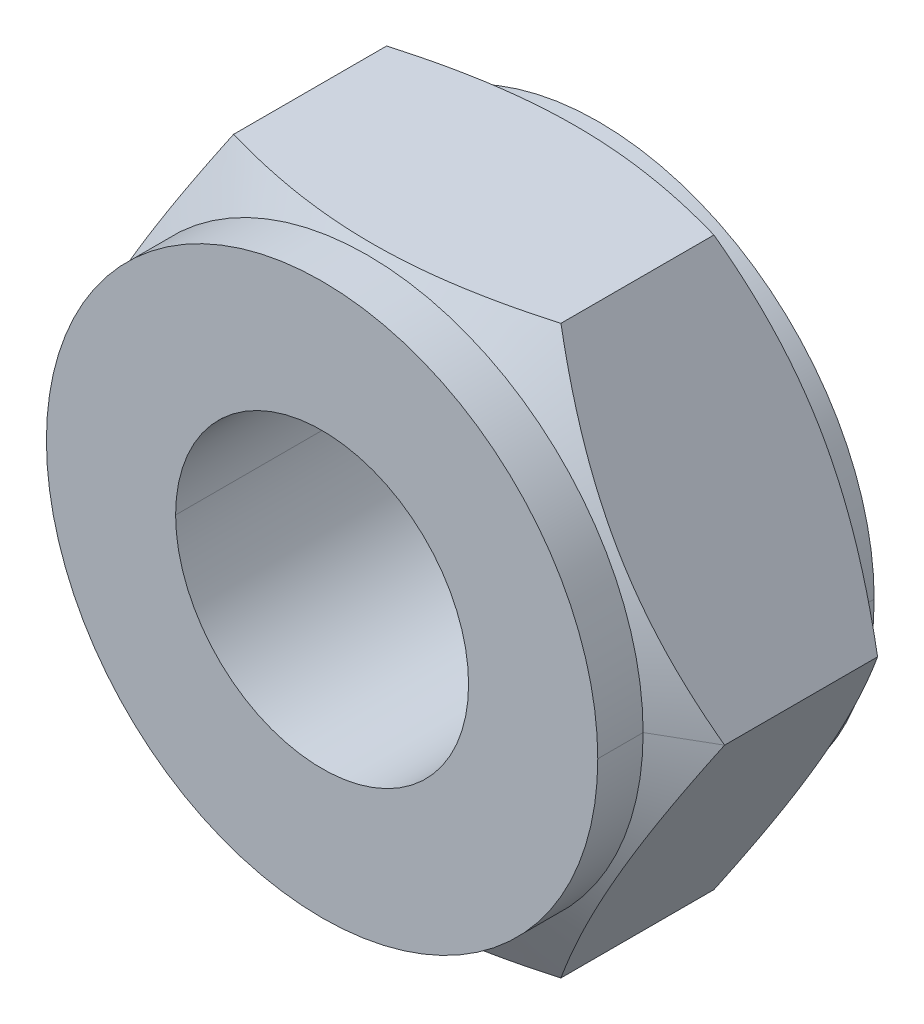
ISO-10303-21;
HEADER;
FILE_DESCRIPTION(('STEP AP214'),'2;1');
FILE_NAME('part.step','',(''),(''),'','','');
FILE_SCHEMA(('AUTOMOTIVE_DESIGN { 1 0 10303 214 1 1 1 1 }'));
ENDSEC;
DATA;
#1=APPLICATION_CONTEXT('core data for automotive mechanical design processes');
#2=APPLICATION_PROTOCOL_DEFINITION('international standard','automotive_design',2000,#1);
#3=PRODUCT_CONTEXT('',#1,'mechanical');
#4=PRODUCT('Part','Part','',(#3));
#5=PRODUCT_RELATED_PRODUCT_CATEGORY('part','',(#4));
#6=PRODUCT_DEFINITION_FORMATION('','',#4);
#7=PRODUCT_DEFINITION_CONTEXT('part definition',#1,'design');
#8=PRODUCT_DEFINITION('design','',#6,#7);
#9=PRODUCT_DEFINITION_SHAPE('','',#8);
#10=(LENGTH_UNIT() NAMED_UNIT(*) SI_UNIT(.MILLI.,.METRE.));
#11=(NAMED_UNIT(*) PLANE_ANGLE_UNIT() SI_UNIT($,.RADIAN.));
#12=(NAMED_UNIT(*) SI_UNIT($,.STERADIAN.) SOLID_ANGLE_UNIT());
#13=UNCERTAINTY_MEASURE_WITH_UNIT(LENGTH_MEASURE(1.E-05),#10,'distance_accuracy_value','');
#14=(GEOMETRIC_REPRESENTATION_CONTEXT(3) GLOBAL_UNCERTAINTY_ASSIGNED_CONTEXT((#13)) GLOBAL_UNIT_ASSIGNED_CONTEXT((#10,
#11,#12)) REPRESENTATION_CONTEXT('',''));
#15=CARTESIAN_POINT('',(0.,0.,0.));
#16=DIRECTION('',(0.,0.,1.));
#17=DIRECTION('',(1.,0.,0.));
#18=AXIS2_PLACEMENT_3D('',#15,#16,#17);
#19=CARTESIAN_POINT('',(0.,0.,0.38));
#20=DIRECTION('',(0.,0.,1.));
#21=DIRECTION('',(-1.,0.,0.));
#22=AXIS2_PLACEMENT_3D('',#19,#20,#21);
#23=PLANE('',#22);
#24=CARTESIAN_POINT('',(0.,0.,0.38));
#25=DIRECTION('',(0.,0.,1.));
#26=DIRECTION('',(1.,0.,0.));
#27=AXIS2_PLACEMENT_3D('',#24,#25,#26);
#28=CIRCLE('',#27,2.067);
#29=CARTESIAN_POINT('',(2.067,0.,0.38));
#30=VERTEX_POINT('',#29);
#31=CARTESIAN_POINT('',(-2.067,0.,0.38));
#32=VERTEX_POINT('',#31);
#33=EDGE_CURVE('E199',#30,#32,#28,.T.);
#34=ORIENTED_EDGE('',*,*,#33,.F.);
#35=CARTESIAN_POINT('',(0.,0.,0.38));
#36=DIRECTION('',(0.,0.,1.));
#37=DIRECTION('',(1.,0.,0.));
#38=AXIS2_PLACEMENT_3D('',#35,#36,#37);
#39=CIRCLE('',#38,2.067);
#40=EDGE_CURVE('E195',#32,#30,#39,.T.);
#41=ORIENTED_EDGE('',*,*,#40,.F.);
#42=EDGE_LOOP('',(#34,#41));
#43=FACE_BOUND('',#42,.T.);
#44=CARTESIAN_POINT('',(0.,0.,0.38));
#45=DIRECTION('',(0.,0.,1.));
#46=DIRECTION('',(1.,0.,0.));
#47=AXIS2_PLACEMENT_3D('',#44,#45,#46);
#48=CIRCLE('',#47,3.89);
#49=CARTESIAN_POINT('',(-3.89,0.,0.38));
#50=VERTEX_POINT('',#49);
#51=CARTESIAN_POINT('',(3.89,0.,0.38));
#52=VERTEX_POINT('',#51);
#53=EDGE_CURVE('E25',#50,#52,#48,.T.);
#54=ORIENTED_EDGE('',*,*,#53,.T.);
#55=CARTESIAN_POINT('',(0.,0.,0.38));
#56=DIRECTION('',(0.,0.,1.));
#57=DIRECTION('',(1.,0.,0.));
#58=AXIS2_PLACEMENT_3D('',#55,#56,#57);
#59=CIRCLE('',#58,3.89);
#60=EDGE_CURVE('E11',#52,#50,#59,.T.);
#61=ORIENTED_EDGE('',*,*,#60,.T.);
#62=EDGE_LOOP('',(#54,#61));
#63=FACE_BOUND('',#62,.T.);
#64=ADVANCED_FACE('F17',(#43,#63),#23,.T.);
#65=CARTESIAN_POINT('',(-4.618802153517,0.,-3.52));
#66=DIRECTION('',(-0.866025403784439,-0.5,0.));
#67=DIRECTION('',(-0.5,0.866025403784439,0.));
#68=AXIS2_PLACEMENT_3D('',#65,#66,#67);
#69=PLANE('',#68);
#70=DIRECTION('',(0.,0.,1.));
#71=VECTOR('',#70,1.);
#72=CARTESIAN_POINT('',(-2.30940107675849,-4.,-3.52));
#73=LINE('',#72,#71);
#74=CARTESIAN_POINT('',(-2.30940107675849,-4.,-2.83941825934564));
#75=VERTEX_POINT('',#74);
#76=CARTESIAN_POINT('',(-2.30940107675849,-4.,-0.680581740654357));
#77=VERTEX_POINT('',#76);
#78=EDGE_CURVE('E214',#75,#77,#73,.T.);
#79=ORIENTED_EDGE('',*,*,#78,.T.);
#80=CARTESIAN_POINT('',(-2.30940107675848,-4.,-0.68058174065436));
#81=CARTESIAN_POINT('',(-2.41088526784455,-3.82422422487392,-0.621972830907661));
#82=CARTESIAN_POINT('',(-2.51324546902432,-3.64693115575758,-0.568671094854789));
#83=CARTESIAN_POINT('',(-2.71973816979664,-3.28927530662781,-0.475634515454877));
#84=CARTESIAN_POINT('',(-2.82387433717053,-3.10890617383074,-0.435932581330531));
#85=CARTESIAN_POINT('',(-3.03085616459838,-2.75040313248224,-0.374133658546513));
#86=CARTESIAN_POINT('',(-3.13366998676625,-2.57232436876715,-0.351625315848155));
#87=CARTESIAN_POINT('',(-3.33978115171077,-2.21532935907603,-0.324760076915223));
#88=CARTESIAN_POINT('',(-3.44307774584343,-2.03641440978945,-0.320380928602726));
#89=CARTESIAN_POINT('',(-3.6360763505888,-1.70213102058057,-0.329514320963898));
#90=CARTESIAN_POINT('',(-3.72580732221447,-1.54671241871238,-0.340784311086834));
#91=CARTESIAN_POINT('',(-3.90468469745536,-1.23688771647059,-0.376496342090638));
#92=CARTESIAN_POINT('',(-3.99383048284328,-1.08248268689808,-0.400950570191663));
#93=CARTESIAN_POINT('',(-4.17307636234661,-0.772019716550943,-0.462081407331009));
#94=CARTESIAN_POINT('',(-4.26315378192128,-0.616001049232918,-0.499017025090961));
#95=CARTESIAN_POINT('',(-4.44196550493154,-0.30629005999022,-0.582845262333055));
#96=CARTESIAN_POINT('',(-4.53070209738485,-0.152593773370545,-0.629718198158769));
#97=CARTESIAN_POINT('',(-4.618802153517,0.,-0.680581740654352));
#98=B_SPLINE_CURVE_WITH_KNOTS('',3,(#80,#81,#82,#83,#84,#85,#86,#87,#88,#89,#90,#91,#92,#93,#94,
#95,#96,#97),.UNSPECIFIED.,.F.,.F.,(4,2,2,2,2,2,2,2,4),(0.,0.634032023113708,1.26958763405422,
1.88941521230584,2.50848177779564,3.04741556526379,3.58684838758882,4.13824324497734,
4.68855594702993),.UNSPECIFIED.);
#99=CARTESIAN_POINT('',(-4.61880215351701,0.,-0.680581740654357));
#100=VERTEX_POINT('',#99);
#101=EDGE_CURVE('E218',#77,#100,#98,.T.);
#102=ORIENTED_EDGE('',*,*,#101,.T.);
#103=DIRECTION('',(0.,0.,1.));
#104=VECTOR('',#103,1.);
#105=CARTESIAN_POINT('',(-4.618802153517,0.,-3.52));
#106=LINE('',#105,#104);
#107=CARTESIAN_POINT('',(-4.618802153517,0.,-2.83941825934565));
#108=VERTEX_POINT('',#107);
#109=EDGE_CURVE('E219',#108,#100,#106,.T.);
#110=ORIENTED_EDGE('',*,*,#109,.F.);
#111=CARTESIAN_POINT('',(-4.618802153517,0.,-2.83941825934565));
#112=CARTESIAN_POINT('',(-4.51731796243094,-0.175775775126077,-2.89802716909234));
#113=CARTESIAN_POINT('',(-4.41495776125117,-0.353068844242418,-2.95132890514522));
#114=CARTESIAN_POINT('',(-4.20846506047885,-0.710724693372193,-3.04436548454513));
#115=CARTESIAN_POINT('',(-4.10432889310496,-0.891093826169261,-3.08406741866947));
#116=CARTESIAN_POINT('',(-3.8973470656771,-1.24959686751776,-3.14586634145349));
#117=CARTESIAN_POINT('',(-3.79453324350924,-1.42767563123285,-3.16837468415185));
#118=CARTESIAN_POINT('',(-3.58842207856472,-1.78467064092398,-3.19523992308478));
#119=CARTESIAN_POINT('',(-3.48512548443206,-1.96358559021056,-3.19961907139727));
#120=CARTESIAN_POINT('',(-3.29212687968669,-2.29786897941944,-3.1904856790361));
#121=CARTESIAN_POINT('',(-3.20239590806102,-2.45328758128763,-3.17921568891317));
#122=CARTESIAN_POINT('',(-3.02351853282013,-2.76311228352941,-3.14350365790936));
#123=CARTESIAN_POINT('',(-2.93437274743221,-2.91751731310192,-3.11904942980834));
#124=CARTESIAN_POINT('',(-2.75512686792888,-3.22798028344906,-3.05791859266899));
#125=CARTESIAN_POINT('',(-2.66504944835421,-3.38399895076709,-3.02098297490904));
#126=CARTESIAN_POINT('',(-2.48623772534395,-3.69370994000978,-2.93715473766694));
#127=CARTESIAN_POINT('',(-2.39750113289063,-3.84740622662946,-2.89028180184123));
#128=CARTESIAN_POINT('',(-2.30940107675848,-4.,-2.83941825934564));
#129=B_SPLINE_CURVE_WITH_KNOTS('',3,(#111,#112,#113,#114,#115,#116,#117,#118,#119,#120,#121,
#122,#123,#124,#125,#126,#127,#128),.UNSPECIFIED.,.F.,.F.,(4,2,2,2,2,2,2,2,4),(0.,
0.634032023113711,1.26958763405422,1.88941521230585,2.50848177779564,3.04741556526379,
3.58684838758882,4.13824324497735,4.68855594702994),.UNSPECIFIED.);
#130=EDGE_CURVE('E117',#108,#75,#129,.T.);
#131=ORIENTED_EDGE('',*,*,#130,.T.);
#132=EDGE_LOOP('',(#79,#102,#110,#131));
#133=FACE_BOUND('',#132,.T.);
#134=ADVANCED_FACE('F254',(#133),#69,.T.);
#135=CARTESIAN_POINT('',(-2.3094010767585,4.,-3.52));
#136=DIRECTION('',(-0.866025403784439,0.5,0.));
#137=DIRECTION('',(0.5,0.866025403784439,0.));
#138=AXIS2_PLACEMENT_3D('',#135,#136,#137);
#139=PLANE('',#138);
#140=ORIENTED_EDGE('',*,*,#109,.T.);
#141=CARTESIAN_POINT('',(-4.61880215351701,0.,-0.68058174065436));
#142=CARTESIAN_POINT('',(-4.51731796243095,0.175775775126075,-0.621972830907662));
#143=CARTESIAN_POINT('',(-4.41495776125117,0.353068844242416,-0.568671094854791));
#144=CARTESIAN_POINT('',(-4.20846506047885,0.710724693372191,-0.475634515454879));
#145=CARTESIAN_POINT('',(-4.10432889310497,0.89109382616926,-0.435932581330532));
#146=CARTESIAN_POINT('',(-3.89734706567711,1.24959686751776,-0.374133658546515));
#147=CARTESIAN_POINT('',(-3.79453324350925,1.42767563123285,-0.351625315848157));
#148=CARTESIAN_POINT('',(-3.58842207856472,1.78467064092398,-0.324760076915226));
#149=CARTESIAN_POINT('',(-3.48512548443207,1.96358559021056,-0.32038092860273));
#150=CARTESIAN_POINT('',(-3.2921268796867,2.29786897941944,-0.329514320963903));
#151=CARTESIAN_POINT('',(-3.20239590806103,2.45328758128763,-0.340784311086839));
#152=CARTESIAN_POINT('',(-3.02351853282014,2.76311228352941,-0.376496342090643));
#153=CARTESIAN_POINT('',(-2.93437274743222,2.91751731310192,-0.400950570191668));
#154=CARTESIAN_POINT('',(-2.75512686792889,3.22798028344906,-0.462081407331014));
#155=CARTESIAN_POINT('',(-2.66504944835422,3.38399895076708,-0.499017025090966));
#156=CARTESIAN_POINT('',(-2.48623772534396,3.69370994000978,-0.58284526233306));
#157=CARTESIAN_POINT('',(-2.39750113289065,3.84740622662945,-0.629718198158774));
#158=CARTESIAN_POINT('',(-2.3094010767585,4.,-0.680581740654358));
#159=B_SPLINE_CURVE_WITH_KNOTS('',3,(#141,#142,#143,#144,#145,#146,#147,#148,#149,#150,#151,
#152,#153,#154,#155,#156,#157,#158),.UNSPECIFIED.,.F.,.F.,(4,2,2,2,2,2,2,2,4),(0.,
0.634032023113711,1.26958763405422,1.88941521230585,2.50848177779564,3.04741556526379,
3.58684838758882,4.13824324497734,4.68855594702993),.UNSPECIFIED.);
#160=CARTESIAN_POINT('',(-2.3094010767585,4.,-0.680581740654358));
#161=VERTEX_POINT('',#160);
#162=EDGE_CURVE('E224',#100,#161,#159,.T.);
#163=ORIENTED_EDGE('',*,*,#162,.T.);
#164=DIRECTION('',(0.,0.,1.));
#165=VECTOR('',#164,1.);
#166=CARTESIAN_POINT('',(-2.3094010767585,4.,-3.52));
#167=LINE('',#166,#165);
#168=CARTESIAN_POINT('',(-2.3094010767585,4.,-2.83941825934564));
#169=VERTEX_POINT('',#168);
#170=EDGE_CURVE('E235',#169,#161,#167,.T.);
#171=ORIENTED_EDGE('',*,*,#170,.F.);
#172=CARTESIAN_POINT('',(-2.3094010767585,4.,-2.83941825934564));
#173=CARTESIAN_POINT('',(-2.41088526784456,3.82422422487391,-2.89802716909234));
#174=CARTESIAN_POINT('',(-2.51324546902433,3.64693115575757,-2.95132890514521));
#175=CARTESIAN_POINT('',(-2.71973816979665,3.2892753066278,-3.04436548454512));
#176=CARTESIAN_POINT('',(-2.82387433717054,3.10890617383073,-3.08406741866947));
#177=CARTESIAN_POINT('',(-3.0308561645984,2.75040313248223,-3.14586634145349));
#178=CARTESIAN_POINT('',(-3.13366998676626,2.57232436876714,-3.16837468415185));
#179=CARTESIAN_POINT('',(-3.33978115171079,2.21532935907601,-3.19523992308478));
#180=CARTESIAN_POINT('',(-3.44307774584344,2.03641440978943,-3.19961907139727));
#181=CARTESIAN_POINT('',(-3.63607635058881,1.70213102058055,-3.1904856790361));
#182=CARTESIAN_POINT('',(-3.72580732221448,1.54671241871236,-3.17921568891316));
#183=CARTESIAN_POINT('',(-3.90468469745537,1.23688771647058,-3.14350365790936));
#184=CARTESIAN_POINT('',(-3.99383048284329,1.08248268689807,-3.11904942980833));
#185=CARTESIAN_POINT('',(-4.17307636234662,0.772019716550935,-3.05791859266899));
#186=CARTESIAN_POINT('',(-4.26315378192129,0.616001049232911,-3.02098297490904));
#187=CARTESIAN_POINT('',(-4.44196550493155,0.306290059990215,-2.93715473766694));
#188=CARTESIAN_POINT('',(-4.53070209738486,0.152593773370542,-2.89028180184123));
#189=CARTESIAN_POINT('',(-4.61880215351701,0.,-2.83941825934564));
#190=B_SPLINE_CURVE_WITH_KNOTS('',3,(#172,#173,#174,#175,#176,#177,#178,#179,#180,#181,#182,
#183,#184,#185,#186,#187,#188,#189),.UNSPECIFIED.,.F.,.F.,(4,2,2,2,2,2,2,2,4),(0.,
0.634032023113711,1.26958763405422,1.88941521230585,2.50848177779565,3.04741556526379,
3.58684838758882,4.13824324497734,4.68855594702993),.UNSPECIFIED.);
#191=EDGE_CURVE('E202',#169,#108,#190,.T.);
#192=ORIENTED_EDGE('',*,*,#191,.T.);
#193=EDGE_LOOP('',(#140,#163,#171,#192));
#194=FACE_BOUND('',#193,.T.);
#195=ADVANCED_FACE('F343',(#194),#139,.T.);
#196=CARTESIAN_POINT('',(-2.30940107675849,-4.,-3.52));
#197=DIRECTION('',(0.,-1.,0.));
#198=DIRECTION('',(-1.,0.,0.));
#199=AXIS2_PLACEMENT_3D('',#196,#197,#198);
#200=PLANE('',#199);
#201=DIRECTION('',(0.,0.,1.));
#202=VECTOR('',#201,1.);
#203=CARTESIAN_POINT('',(2.30940107675852,-4.,-3.52));
#204=LINE('',#203,#202);
#205=CARTESIAN_POINT('',(2.30940107675852,-4.,-2.83941825934564));
#206=VERTEX_POINT('',#205);
#207=CARTESIAN_POINT('',(2.30940107675852,-4.,-0.680581740654358));
#208=VERTEX_POINT('',#207);
#209=EDGE_CURVE('E203',#206,#208,#204,.T.);
#210=ORIENTED_EDGE('',*,*,#209,.T.);
#211=CARTESIAN_POINT('',(2.30940107675852,-4.,-0.680581740654358));
#212=CARTESIAN_POINT('',(2.10643269458639,-4.,-0.621972830907662));
#213=CARTESIAN_POINT('',(1.90171229222684,-4.,-0.568671094854791));
#214=CARTESIAN_POINT('',(1.48872689068221,-4.,-0.47563451545488));
#215=CARTESIAN_POINT('',(1.28045455593443,-4.,-0.435932581330533));
#216=CARTESIAN_POINT('',(0.866490901078722,-4.,-0.374133658546515));
#217=CARTESIAN_POINT('',(0.660863256742991,-4.,-0.351625315848158));
#218=CARTESIAN_POINT('',(0.248640926853943,-4.,-0.324760076915226));
#219=CARTESIAN_POINT('',(0.0420477385886325,-4.,-0.320380928602728));
#220=CARTESIAN_POINT('',(-0.343949470902104,-4.,-0.329514320963901));
#221=CARTESIAN_POINT('',(-0.523411414153448,-4.,-0.340784311086839));
#222=CARTESIAN_POINT('',(-0.881166164635223,-4.,-0.376496342090643));
#223=CARTESIAN_POINT('',(-1.05945773541106,-4.,-0.400950570191667));
#224=CARTESIAN_POINT('',(-1.41794949441772,-4.,-0.462081407331012));
#225=CARTESIAN_POINT('',(-1.59810433356706,-4.,-0.499017025090964));
#226=CARTESIAN_POINT('',(-1.95572777958756,-4.,-0.582845262333057));
#227=CARTESIAN_POINT('',(-2.13320096449419,-4.,-0.629718198158769));
#228=CARTESIAN_POINT('',(-2.30940107675849,-4.,-0.680581740654351));
#229=B_SPLINE_CURVE_WITH_KNOTS('',3,(#211,#212,#213,#214,#215,#216,#217,#218,#219,#220,#221,
#222,#223,#224,#225,#226,#227,#228),.UNSPECIFIED.,.F.,.F.,(4,2,2,2,2,2,2,2,4),(0.,
0.634032023113711,1.26958763405422,1.88941521230585,2.50848177779565,3.04741556526379,
3.58684838758881,4.13824324497733,4.68855594702991),.UNSPECIFIED.);
#230=EDGE_CURVE('E206',#208,#77,#229,.T.);
#231=ORIENTED_EDGE('',*,*,#230,.T.);
#232=ORIENTED_EDGE('',*,*,#78,.F.);
#233=CARTESIAN_POINT('',(-2.30940107675849,-4.,-2.83941825934565));
#234=CARTESIAN_POINT('',(-2.10643269458636,-4.,-2.89802716909235));
#235=CARTESIAN_POINT('',(-1.90171229222682,-4.,-2.95132890514522));
#236=CARTESIAN_POINT('',(-1.48872689068218,-4.,-3.04436548454513));
#237=CARTESIAN_POINT('',(-1.2804545559344,-4.,-3.08406741866947));
#238=CARTESIAN_POINT('',(-0.866490901078693,-4.,-3.14586634145349));
#239=CARTESIAN_POINT('',(-0.660863256742963,-4.,-3.16837468415185));
#240=CARTESIAN_POINT('',(-0.248640926853916,-4.,-3.19523992308478));
#241=CARTESIAN_POINT('',(-0.0420477385886054,-4.,-3.19961907139727));
#242=CARTESIAN_POINT('',(0.343949470902131,-4.,-3.1904856790361));
#243=CARTESIAN_POINT('',(0.523411414153476,-4.,-3.17921568891316));
#244=CARTESIAN_POINT('',(0.881166164635252,-4.,-3.14350365790936));
#245=CARTESIAN_POINT('',(1.05945773541109,-4.,-3.11904942980833));
#246=CARTESIAN_POINT('',(1.41794949441775,-4.,-3.05791859266899));
#247=CARTESIAN_POINT('',(1.59810433356709,-4.,-3.02098297490903));
#248=CARTESIAN_POINT('',(1.95572777958759,-4.,-2.93715473766694));
#249=CARTESIAN_POINT('',(2.13320096449422,-4.,-2.89028180184123));
#250=CARTESIAN_POINT('',(2.30940107675852,-4.,-2.83941825934564));
#251=B_SPLINE_CURVE_WITH_KNOTS('',3,(#233,#234,#235,#236,#237,#238,#239,#240,#241,#242,#243,
#244,#245,#246,#247,#248,#249,#250),.UNSPECIFIED.,.F.,.F.,(4,2,2,2,2,2,2,2,4),(0.,
0.63403202311371,1.26958763405422,1.88941521230584,2.50848177779564,3.04741556526379,
3.58684838758881,4.13824324497733,4.68855594702991),.UNSPECIFIED.);
#252=EDGE_CURVE('E138',#75,#206,#251,.T.);
#253=ORIENTED_EDGE('',*,*,#252,.T.);
#254=EDGE_LOOP('',(#210,#231,#232,#253));
#255=FACE_BOUND('',#254,.T.);
#256=ADVANCED_FACE('F352',(#255),#200,.T.);
#257=CARTESIAN_POINT('',(0.,0.,-3.52));
#258=DIRECTION('',(0.,0.,1.));
#259=DIRECTION('',(-1.,0.,0.));
#260=AXIS2_PLACEMENT_3D('',#257,#258,#259);
#261=CONICAL_SURFACE('',#260,3.44,1.0471975511966);
#262=DIRECTION('',(-0.866025403784437,0.,0.5));
#263=VECTOR('',#262,1.);
#264=CARTESIAN_POINT('',(-3.44,0.,-3.52));
#265=LINE('',#264,#263);
#266=CARTESIAN_POINT('',(-3.89,0.,-3.26019237886467));
#267=VERTEX_POINT('',#266);
#268=EDGE_CURVE('E108',#108,#267,#265,.F.);
#269=ORIENTED_EDGE('',*,*,#268,.T.);
#270=CARTESIAN_POINT('',(0.,0.,-3.26019237886467));
#271=DIRECTION('',(0.,0.,1.));
#272=DIRECTION('',(1.,0.,0.));
#273=AXIS2_PLACEMENT_3D('',#270,#271,#272);
#274=CIRCLE('',#273,3.89);
#275=CARTESIAN_POINT('',(3.89,0.,-3.26019237886467));
#276=VERTEX_POINT('',#275);
#277=EDGE_CURVE('E111',#267,#276,#274,.T.);
#278=ORIENTED_EDGE('',*,*,#277,.T.);
#279=DIRECTION('',(0.866025403784437,0.,0.5));
#280=VECTOR('',#279,1.);
#281=CARTESIAN_POINT('',(3.44,0.,-3.52));
#282=LINE('',#281,#280);
#283=CARTESIAN_POINT('',(4.61880215351701,0.,-2.83941825934564));
#284=VERTEX_POINT('',#283);
#285=EDGE_CURVE('E130',#284,#276,#282,.F.);
#286=ORIENTED_EDGE('',*,*,#285,.F.);
#287=CARTESIAN_POINT('',(2.30940107675851,-4.,-2.83941825934564));
#288=CARTESIAN_POINT('',(2.41088526784457,-3.82422422487392,-2.89802716909234));
#289=CARTESIAN_POINT('',(2.51324546902435,-3.64693115575757,-2.95132890514521));
#290=CARTESIAN_POINT('',(2.71973816979667,-3.2892753066278,-3.04436548454512));
#291=CARTESIAN_POINT('',(2.82387433717056,-3.10890617383073,-3.08406741866947));
#292=CARTESIAN_POINT('',(3.03085616459841,-2.75040313248223,-3.14586634145348));
#293=CARTESIAN_POINT('',(3.13366998676628,-2.57232436876714,-3.16837468415184));
#294=CARTESIAN_POINT('',(3.3397811517108,-2.21532935907601,-3.19523992308477));
#295=CARTESIAN_POINT('',(3.44307774584346,-2.03641440978943,-3.19961907139726));
#296=CARTESIAN_POINT('',(3.63607635058882,-1.70213102058055,-3.19048567903609));
#297=CARTESIAN_POINT('',(3.7258073222145,-1.54671241871236,-3.17921568891316));
#298=CARTESIAN_POINT('',(3.90468469745539,-1.23688771647058,-3.14350365790935));
#299=CARTESIAN_POINT('',(3.99383048284331,-1.08248268689807,-3.11904942980833));
#300=CARTESIAN_POINT('',(4.17307636234663,-0.772019716550943,-3.05791859266898));
#301=CARTESIAN_POINT('',(4.2631537819213,-0.616001049232921,-3.02098297490903));
#302=CARTESIAN_POINT('',(4.44196550493155,-0.306290059990228,-2.93715473766694));
#303=CARTESIAN_POINT('',(4.53070209738487,-0.152593773370555,-2.89028180184122));
#304=CARTESIAN_POINT('',(4.61880215351701,0.,-2.83941825934564));
#305=B_SPLINE_CURVE_WITH_KNOTS('',3,(#287,#288,#289,#290,#291,#292,#293,#294,#295,#296,#297,
#298,#299,#300,#301,#302,#303,#304),.UNSPECIFIED.,.F.,.F.,(4,2,2,2,2,2,2,2,4),(0.,
0.634032023113712,1.26958763405422,1.88941521230585,2.50848177779565,3.04741556526379,
3.58684838758881,4.13824324497733,4.68855594702991),.UNSPECIFIED.);
#306=EDGE_CURVE('E148',#206,#284,#305,.T.);
#307=ORIENTED_EDGE('',*,*,#306,.F.);
#308=ORIENTED_EDGE('',*,*,#252,.F.);
#309=ORIENTED_EDGE('',*,*,#130,.F.);
#310=EDGE_LOOP('',(#269,#278,#286,#307,#308,#309));
#311=FACE_BOUND('',#310,.T.);
#312=ADVANCED_FACE('F112',(#311),#261,.T.);
#313=CARTESIAN_POINT('',(0.,0.,-0.68058174065436));
#314=DIRECTION('',(0.,0.,-1.));
#315=DIRECTION('',(1.,0.,0.));
#316=AXIS2_PLACEMENT_3D('',#313,#314,#315);
#317=CONICAL_SURFACE('',#316,4.61880215351701,1.0471975511966);
#318=DIRECTION('',(0.866025403784437,0.,-0.5));
#319=VECTOR('',#318,1.);
#320=CARTESIAN_POINT('',(4.61880215351701,0.,-0.68058174065436));
#321=LINE('',#320,#319);
#322=CARTESIAN_POINT('',(3.89,0.,-0.259807621135333));
#323=VERTEX_POINT('',#322);
#324=CARTESIAN_POINT('',(4.61880215351701,0.,-0.68058174065436));
#325=VERTEX_POINT('',#324);
#326=EDGE_CURVE('E229',#323,#325,#321,.T.);
#327=ORIENTED_EDGE('',*,*,#326,.F.);
#328=CARTESIAN_POINT('',(0.,0.,-0.259807621135333));
#329=DIRECTION('',(0.,0.,-1.));
#330=DIRECTION('',(-1.,0.,0.));
#331=AXIS2_PLACEMENT_3D('',#328,#329,#330);
#332=CIRCLE('',#331,3.89);
#333=CARTESIAN_POINT('',(-3.89,0.,-0.259807621135333));
#334=VERTEX_POINT('',#333);
#335=EDGE_CURVE('E207',#323,#334,#332,.T.);
#336=ORIENTED_EDGE('',*,*,#335,.T.);
#337=DIRECTION('',(-0.866025403784437,0.,-0.5));
#338=VECTOR('',#337,1.);
#339=CARTESIAN_POINT('',(-4.61880215351701,0.,-0.68058174065436));
#340=LINE('',#339,#338);
#341=EDGE_CURVE('E129',#334,#100,#340,.T.);
#342=ORIENTED_EDGE('',*,*,#341,.T.);
#343=ORIENTED_EDGE('',*,*,#101,.F.);
#344=ORIENTED_EDGE('',*,*,#230,.F.);
#345=CARTESIAN_POINT('',(4.61880215351701,0.,-0.68058174065436));
#346=CARTESIAN_POINT('',(4.51731796243095,-0.175775775126093,-0.621972830907665));
#347=CARTESIAN_POINT('',(4.41495776125118,-0.353068844242435,-0.568671094854794));
#348=CARTESIAN_POINT('',(4.20846506047886,-0.710724693372211,-0.475634515454883));
#349=CARTESIAN_POINT('',(4.10432889310497,-0.89109382616928,-0.435932581330537));
#350=CARTESIAN_POINT('',(3.89734706567712,-1.24959686751778,-0.374133658546521));
#351=CARTESIAN_POINT('',(3.79453324350925,-1.42767563123287,-0.351625315848164));
#352=CARTESIAN_POINT('',(3.58842207856473,-1.784670640924,-0.324760076915233));
#353=CARTESIAN_POINT('',(3.48512548443207,-1.96358559021058,-0.320380928602735));
#354=CARTESIAN_POINT('',(3.2921268796867,-2.29786897941946,-0.329514320963909));
#355=CARTESIAN_POINT('',(3.20239590806103,-2.45328758128764,-0.340784311086847));
#356=CARTESIAN_POINT('',(3.02351853282015,-2.76311228352942,-0.376496342090652));
#357=CARTESIAN_POINT('',(2.93437274743222,-2.91751731310193,-0.400950570191676));
#358=CARTESIAN_POINT('',(2.7551268679289,-3.22798028344906,-0.462081407331021));
#359=CARTESIAN_POINT('',(2.66504944835423,-3.38399895076709,-0.499017025090973));
#360=CARTESIAN_POINT('',(2.48623772534398,-3.69370994000978,-0.582845262333066));
#361=CARTESIAN_POINT('',(2.39750113289066,-3.84740622662945,-0.629718198158777));
#362=CARTESIAN_POINT('',(2.30940107675852,-4.,-0.680581740654358));
#363=B_SPLINE_CURVE_WITH_KNOTS('',3,(#345,#346,#347,#348,#349,#350,#351,#352,#353,#354,#355,
#356,#357,#358,#359,#360,#361,#362),.UNSPECIFIED.,.F.,.F.,(4,2,2,2,2,2,2,2,4),(0.,
0.63403202311371,1.26958763405422,1.88941521230585,2.50848177779565,3.04741556526379,
3.58684838758881,4.13824324497732,4.68855594702991),.UNSPECIFIED.);
#364=EDGE_CURVE('E152',#325,#208,#363,.T.);
#365=ORIENTED_EDGE('',*,*,#364,.F.);
#366=EDGE_LOOP('',(#327,#336,#342,#343,#344,#365));
#367=FACE_BOUND('',#366,.T.);
#368=ADVANCED_FACE('F256',(#367),#317,.T.);
#369=CARTESIAN_POINT('',(0.,0.,-3.52));
#370=DIRECTION('',(0.,0.,1.));
#371=DIRECTION('',(-1.,0.,0.));
#372=AXIS2_PLACEMENT_3D('',#369,#370,#371);
#373=CONICAL_SURFACE('',#372,3.44,1.0471975511966);
#374=CARTESIAN_POINT('',(0.,0.,-3.26019237886467));
#375=DIRECTION('',(0.,0.,1.));
#376=DIRECTION('',(1.,0.,0.));
#377=AXIS2_PLACEMENT_3D('',#374,#375,#376);
#378=CIRCLE('',#377,3.89);
#379=EDGE_CURVE('E121',#276,#267,#378,.T.);
#380=ORIENTED_EDGE('',*,*,#379,.T.);
#381=ORIENTED_EDGE('',*,*,#268,.F.);
#382=ORIENTED_EDGE('',*,*,#191,.F.);
#383=CARTESIAN_POINT('',(2.30940107675849,4.,-2.83941825934564));
#384=CARTESIAN_POINT('',(2.10643269458637,4.,-2.89802716909234));
#385=CARTESIAN_POINT('',(1.90171229222683,4.,-2.95132890514521));
#386=CARTESIAN_POINT('',(1.48872689068219,4.,-3.04436548454513));
#387=CARTESIAN_POINT('',(1.28045455593441,4.,-3.08406741866947));
#388=CARTESIAN_POINT('',(0.866490901078704,4.,-3.14586634145349));
#389=CARTESIAN_POINT('',(0.660863256742973,4.,-3.16837468415185));
#390=CARTESIAN_POINT('',(0.248640926853926,4.,-3.19523992308477));
#391=CARTESIAN_POINT('',(0.0420477385886148,4.,-3.19961907139726));
#392=CARTESIAN_POINT('',(-0.343949470902122,4.,-3.19048567903609));
#393=CARTESIAN_POINT('',(-0.523411414153467,4.,-3.17921568891316));
#394=CARTESIAN_POINT('',(-0.881166164635242,4.,-3.14350365790936));
#395=CARTESIAN_POINT('',(-1.05945773541108,4.,-3.11904942980833));
#396=CARTESIAN_POINT('',(-1.41794949441774,4.,-3.05791859266898));
#397=CARTESIAN_POINT('',(-1.59810433356708,4.,-3.02098297490903));
#398=CARTESIAN_POINT('',(-1.95572777958759,4.,-2.93715473766694));
#399=CARTESIAN_POINT('',(-2.13320096449421,4.,-2.89028180184123));
#400=CARTESIAN_POINT('',(-2.30940107675851,4.,-2.83941825934564));
#401=B_SPLINE_CURVE_WITH_KNOTS('',3,(#383,#384,#385,#386,#387,#388,#389,#390,#391,#392,#393,
#394,#395,#396,#397,#398,#399,#400),.UNSPECIFIED.,.F.,.F.,(4,2,2,2,2,2,2,2,4),(0.,
0.634032023113711,1.26958763405422,1.88941521230585,2.50848177779564,3.04741556526379,
3.58684838758881,4.13824324497733,4.68855594702991),.UNSPECIFIED.);
#402=CARTESIAN_POINT('',(2.30940107675849,4.,-2.83941825934564));
#403=VERTEX_POINT('',#402);
#404=EDGE_CURVE('E212',#403,#169,#401,.T.);
#405=ORIENTED_EDGE('',*,*,#404,.F.);
#406=CARTESIAN_POINT('',(4.61880215351701,0.,-2.83941825934564));
#407=CARTESIAN_POINT('',(4.51731796243095,0.175775775126079,-2.89802716909234));
#408=CARTESIAN_POINT('',(4.41495776125118,0.35306884424242,-2.95132890514521));
#409=CARTESIAN_POINT('',(4.20846506047886,0.710724693372195,-3.04436548454512));
#410=CARTESIAN_POINT('',(4.10432889310497,0.891093826169264,-3.08406741866947));
#411=CARTESIAN_POINT('',(3.89734706567711,1.24959686751776,-3.14586634145349));
#412=CARTESIAN_POINT('',(3.79453324350925,1.42767563123286,-3.16837468415184));
#413=CARTESIAN_POINT('',(3.58842207856472,1.78467064092398,-3.19523992308477));
#414=CARTESIAN_POINT('',(3.48512548443207,1.96358559021056,-3.19961907139727));
#415=CARTESIAN_POINT('',(3.2921268796867,2.29786897941944,-3.1904856790361));
#416=CARTESIAN_POINT('',(3.20239590806103,2.45328758128763,-3.17921568891316));
#417=CARTESIAN_POINT('',(3.02351853282014,2.76311228352941,-3.14350365790936));
#418=CARTESIAN_POINT('',(2.93437274743222,2.91751731310193,-3.11904942980833));
#419=CARTESIAN_POINT('',(2.75512686792889,3.22798028344906,-3.05791859266899));
#420=CARTESIAN_POINT('',(2.66504944835422,3.38399895076709,-3.02098297490903));
#421=CARTESIAN_POINT('',(2.48623772534396,3.69370994000978,-2.93715473766694));
#422=CARTESIAN_POINT('',(2.39750113289065,3.84740622662945,-2.89028180184123));
#423=CARTESIAN_POINT('',(2.30940107675849,4.,-2.83941825934564));
#424=B_SPLINE_CURVE_WITH_KNOTS('',3,(#406,#407,#408,#409,#410,#411,#412,#413,#414,#415,#416,
#417,#418,#419,#420,#421,#422,#423),.UNSPECIFIED.,.F.,.F.,(4,2,2,2,2,2,2,2,4),(0.,
0.634032023113712,1.26958763405422,1.88941521230585,2.50848177779565,3.04741556526379,
3.58684838758882,4.13824324497734,4.68855594702993),.UNSPECIFIED.);
#425=EDGE_CURVE('E321',#284,#403,#424,.T.);
#426=ORIENTED_EDGE('',*,*,#425,.F.);
#427=ORIENTED_EDGE('',*,*,#285,.T.);
#428=EDGE_LOOP('',(#380,#381,#382,#405,#426,#427));
#429=FACE_BOUND('',#428,.T.);
#430=ADVANCED_FACE('F124',(#429),#373,.T.);
#431=CARTESIAN_POINT('',(0.,0.,-0.68058174065436));
#432=DIRECTION('',(0.,0.,-1.));
#433=DIRECTION('',(1.,0.,0.));
#434=AXIS2_PLACEMENT_3D('',#431,#432,#433);
#435=CONICAL_SURFACE('',#434,4.61880215351701,1.0471975511966);
#436=CARTESIAN_POINT('',(0.,0.,-0.259807621135333));
#437=DIRECTION('',(0.,0.,-1.));
#438=DIRECTION('',(-1.,0.,0.));
#439=AXIS2_PLACEMENT_3D('',#436,#437,#438);
#440=CIRCLE('',#439,3.89);
#441=EDGE_CURVE('E125',#334,#323,#440,.T.);
#442=ORIENTED_EDGE('',*,*,#441,.T.);
#443=ORIENTED_EDGE('',*,*,#326,.T.);
#444=CARTESIAN_POINT('',(2.30940107675849,4.,-0.68058174065436));
#445=CARTESIAN_POINT('',(2.41088526784456,3.82422422487392,-0.621972830907663));
#446=CARTESIAN_POINT('',(2.51324546902434,3.64693115575758,-0.568671094854792));
#447=CARTESIAN_POINT('',(2.71973816979666,3.2892753066278,-0.47563451545488));
#448=CARTESIAN_POINT('',(2.82387433717054,3.10890617383073,-0.435932581330533));
#449=CARTESIAN_POINT('',(3.0308561645984,2.75040313248224,-0.374133658546516));
#450=CARTESIAN_POINT('',(3.13366998676626,2.57232436876714,-0.351625315848158));
#451=CARTESIAN_POINT('',(3.33978115171079,2.21532935907602,-0.324760076915227));
#452=CARTESIAN_POINT('',(3.44307774584344,2.03641440978944,-0.320380928602731));
#453=CARTESIAN_POINT('',(3.63607635058881,1.70213102058056,-0.329514320963904));
#454=CARTESIAN_POINT('',(3.72580732221448,1.54671241871237,-0.34078431108684));
#455=CARTESIAN_POINT('',(3.90468469745537,1.23688771647059,-0.376496342090645));
#456=CARTESIAN_POINT('',(3.99383048284329,1.08248268689807,-0.40095057019167));
#457=CARTESIAN_POINT('',(4.17307636234662,0.772019716550937,-0.462081407331016));
#458=CARTESIAN_POINT('',(4.26315378192129,0.616001049232913,-0.499017025090969));
#459=CARTESIAN_POINT('',(4.44196550493155,0.306290059990216,-0.582845262333063));
#460=CARTESIAN_POINT('',(4.53070209738486,0.152593773370541,-0.629718198158776));
#461=CARTESIAN_POINT('',(4.61880215351701,0.,-0.68058174065436));
#462=B_SPLINE_CURVE_WITH_KNOTS('',3,(#444,#445,#446,#447,#448,#449,#450,#451,#452,#453,#454,
#455,#456,#457,#458,#459,#460,#461),.UNSPECIFIED.,.F.,.F.,(4,2,2,2,2,2,2,2,4),(0.,
0.63403202311371,1.26958763405422,1.88941521230585,2.50848177779564,3.04741556526379,
3.58684838758882,4.13824324497734,4.68855594702993),.UNSPECIFIED.);
#463=CARTESIAN_POINT('',(2.3094010767585,4.,-0.680581740654359));
#464=VERTEX_POINT('',#463);
#465=EDGE_CURVE('E237',#464,#325,#462,.T.);
#466=ORIENTED_EDGE('',*,*,#465,.F.);
#467=CARTESIAN_POINT('',(-2.30940107675851,4.,-0.68058174065436));
#468=CARTESIAN_POINT('',(-2.10643269458638,4.,-0.621972830907663));
#469=CARTESIAN_POINT('',(-1.90171229222683,4.,-0.568671094854792));
#470=CARTESIAN_POINT('',(-1.48872689068219,4.,-0.475634515454881));
#471=CARTESIAN_POINT('',(-1.28045455593442,4.,-0.435932581330534));
#472=CARTESIAN_POINT('',(-0.86649090107871,4.,-0.374133658546517));
#473=CARTESIAN_POINT('',(-0.660863256742979,4.,-0.351625315848159));
#474=CARTESIAN_POINT('',(-0.248640926853931,4.,-0.324760076915229));
#475=CARTESIAN_POINT('',(-0.0420477385886199,4.,-0.320380928602733));
#476=CARTESIAN_POINT('',(0.343949470902117,4.,-0.329514320963906));
#477=CARTESIAN_POINT('',(0.523411414153462,4.,-0.340784311086842));
#478=CARTESIAN_POINT('',(0.881166164635237,4.,-0.376496342090646));
#479=CARTESIAN_POINT('',(1.05945773541108,4.,-0.40095057019167));
#480=CARTESIAN_POINT('',(1.41794949441774,4.,-0.462081407331016));
#481=CARTESIAN_POINT('',(1.59810433356707,4.,-0.499017025090968));
#482=CARTESIAN_POINT('',(1.95572777958758,4.,-0.582845262333061));
#483=CARTESIAN_POINT('',(2.13320096449421,4.,-0.629718198158774));
#484=CARTESIAN_POINT('',(2.3094010767585,4.,-0.680581740654357));
#485=B_SPLINE_CURVE_WITH_KNOTS('',3,(#467,#468,#469,#470,#471,#472,#473,#474,#475,#476,#477,
#478,#479,#480,#481,#482,#483,#484),.UNSPECIFIED.,.F.,.F.,(4,2,2,2,2,2,2,2,4),(0.,
0.634032023113711,1.26958763405422,1.88941521230585,2.50848177779565,3.04741556526379,
3.58684838758882,4.13824324497733,4.68855594702992),.UNSPECIFIED.);
#486=EDGE_CURVE('E234',#161,#464,#485,.T.);
#487=ORIENTED_EDGE('',*,*,#486,.F.);
#488=ORIENTED_EDGE('',*,*,#162,.F.);
#489=ORIENTED_EDGE('',*,*,#341,.F.);
#490=EDGE_LOOP('',(#442,#443,#466,#487,#488,#489));
#491=FACE_BOUND('',#490,.T.);
#492=ADVANCED_FACE('F377',(#491),#435,.T.);
#493=CARTESIAN_POINT('',(2.3094010767585,4.,-3.52));
#494=DIRECTION('',(0.,1.,0.));
#495=DIRECTION('',(1.,0.,0.));
#496=AXIS2_PLACEMENT_3D('',#493,#494,#495);
#497=PLANE('',#496);
#498=ORIENTED_EDGE('',*,*,#170,.T.);
#499=ORIENTED_EDGE('',*,*,#486,.T.);
#500=DIRECTION('',(0.,0.,1.));
#501=VECTOR('',#500,1.);
#502=CARTESIAN_POINT('',(2.3094010767585,4.,-3.52));
#503=LINE('',#502,#501);
#504=EDGE_CURVE('E170',#403,#464,#503,.T.);
#505=ORIENTED_EDGE('',*,*,#504,.F.);
#506=ORIENTED_EDGE('',*,*,#404,.T.);
#507=EDGE_LOOP('',(#498,#499,#505,#506));
#508=FACE_BOUND('',#507,.T.);
#509=ADVANCED_FACE('F299',(#508),#497,.T.);
#510=CARTESIAN_POINT('',(2.30940107675852,-4.,-3.52));
#511=DIRECTION('',(0.866025403784439,-0.5,0.));
#512=DIRECTION('',(-0.5,-0.866025403784439,0.));
#513=AXIS2_PLACEMENT_3D('',#510,#511,#512);
#514=PLANE('',#513);
#515=DIRECTION('',(0.,0.,1.));
#516=VECTOR('',#515,1.);
#517=CARTESIAN_POINT('',(4.61880215351701,0.,-3.52));
#518=LINE('',#517,#516);
#519=EDGE_CURVE('E209',#284,#325,#518,.T.);
#520=ORIENTED_EDGE('',*,*,#519,.T.);
#521=ORIENTED_EDGE('',*,*,#364,.T.);
#522=ORIENTED_EDGE('',*,*,#209,.F.);
#523=ORIENTED_EDGE('',*,*,#306,.T.);
#524=EDGE_LOOP('',(#520,#521,#522,#523));
#525=FACE_BOUND('',#524,.T.);
#526=ADVANCED_FACE('F296',(#525),#514,.T.);
#527=CARTESIAN_POINT('',(0.,0.,3.28));
#528=DIRECTION('',(0.,0.,-1.));
#529=DIRECTION('',(1.,0.,0.));
#530=AXIS2_PLACEMENT_3D('',#527,#528,#529);
#531=CYLINDRICAL_SURFACE('',#530,3.89);
#532=DIRECTION('',(0.,0.,-1.));
#533=VECTOR('',#532,1.);
#534=CARTESIAN_POINT('',(3.89,0.,3.28));
#535=LINE('',#534,#533);
#536=CARTESIAN_POINT('',(3.89,0.,-3.52));
#537=VERTEX_POINT('',#536);
#538=EDGE_CURVE('E139',#276,#537,#535,.T.);
#539=ORIENTED_EDGE('',*,*,#538,.F.);
#540=ORIENTED_EDGE('',*,*,#277,.F.);
#541=DIRECTION('',(0.,0.,-1.));
#542=VECTOR('',#541,1.);
#543=CARTESIAN_POINT('',(-3.89,0.,3.28));
#544=LINE('',#543,#542);
#545=CARTESIAN_POINT('',(-3.89,0.,-3.52));
#546=VERTEX_POINT('',#545);
#547=EDGE_CURVE('E137',#267,#546,#544,.T.);
#548=ORIENTED_EDGE('',*,*,#547,.T.);
#549=CARTESIAN_POINT('',(0.,0.,-3.52));
#550=DIRECTION('',(0.,0.,1.));
#551=DIRECTION('',(1.,0.,0.));
#552=AXIS2_PLACEMENT_3D('',#549,#550,#551);
#553=CIRCLE('',#552,3.89);
#554=EDGE_CURVE('E150',#546,#537,#553,.T.);
#555=ORIENTED_EDGE('',*,*,#554,.T.);
#556=EDGE_LOOP('',(#539,#540,#548,#555));
#557=FACE_BOUND('',#556,.T.);
#558=ADVANCED_FACE('F133',(#557),#531,.T.);
#559=CARTESIAN_POINT('',(0.,0.,3.28));
#560=DIRECTION('',(0.,0.,-1.));
#561=DIRECTION('',(1.,0.,0.));
#562=AXIS2_PLACEMENT_3D('',#559,#560,#561);
#563=CYLINDRICAL_SURFACE('',#562,3.89);
#564=ORIENTED_EDGE('',*,*,#53,.F.);
#565=DIRECTION('',(0.,0.,-1.));
#566=VECTOR('',#565,1.);
#567=CARTESIAN_POINT('',(-3.89,0.,3.28));
#568=LINE('',#567,#566);
#569=EDGE_CURVE('E156',#50,#334,#568,.T.);
#570=ORIENTED_EDGE('',*,*,#569,.T.);
#571=ORIENTED_EDGE('',*,*,#335,.F.);
#572=DIRECTION('',(0.,0.,-1.));
#573=VECTOR('',#572,1.);
#574=CARTESIAN_POINT('',(3.89,0.,3.28));
#575=LINE('',#574,#573);
#576=EDGE_CURVE('E161',#52,#323,#575,.T.);
#577=ORIENTED_EDGE('',*,*,#576,.F.);
#578=EDGE_LOOP('',(#564,#570,#571,#577));
#579=FACE_BOUND('',#578,.T.);
#580=ADVANCED_FACE('F308',(#579),#563,.T.);
#581=CARTESIAN_POINT('',(4.61880215351701,0.,-3.52));
#582=DIRECTION('',(0.866025403784439,0.5,0.));
#583=DIRECTION('',(0.5,-0.866025403784439,0.));
#584=AXIS2_PLACEMENT_3D('',#581,#582,#583);
#585=PLANE('',#584);
#586=ORIENTED_EDGE('',*,*,#504,.T.);
#587=ORIENTED_EDGE('',*,*,#465,.T.);
#588=ORIENTED_EDGE('',*,*,#519,.F.);
#589=ORIENTED_EDGE('',*,*,#425,.T.);
#590=EDGE_LOOP('',(#586,#587,#588,#589));
#591=FACE_BOUND('',#590,.T.);
#592=ADVANCED_FACE('F310',(#591),#585,.T.);
#593=CARTESIAN_POINT('',(0.,0.,3.28));
#594=DIRECTION('',(0.,0.,-1.));
#595=DIRECTION('',(1.,0.,0.));
#596=AXIS2_PLACEMENT_3D('',#593,#594,#595);
#597=CYLINDRICAL_SURFACE('',#596,3.89);
#598=ORIENTED_EDGE('',*,*,#379,.F.);
#599=ORIENTED_EDGE('',*,*,#538,.T.);
#600=CARTESIAN_POINT('',(0.,0.,-3.52));
#601=DIRECTION('',(0.,0.,1.));
#602=DIRECTION('',(1.,0.,0.));
#603=AXIS2_PLACEMENT_3D('',#600,#601,#602);
#604=CIRCLE('',#603,3.89);
#605=EDGE_CURVE('E145',#537,#546,#604,.T.);
#606=ORIENTED_EDGE('',*,*,#605,.T.);
#607=ORIENTED_EDGE('',*,*,#547,.F.);
#608=EDGE_LOOP('',(#598,#599,#606,#607));
#609=FACE_BOUND('',#608,.T.);
#610=ADVANCED_FACE('F142',(#609),#597,.T.);
#611=CARTESIAN_POINT('',(0.,0.,3.28));
#612=DIRECTION('',(0.,0.,-1.));
#613=DIRECTION('',(1.,0.,0.));
#614=AXIS2_PLACEMENT_3D('',#611,#612,#613);
#615=CYLINDRICAL_SURFACE('',#614,3.89);
#616=ORIENTED_EDGE('',*,*,#60,.F.);
#617=ORIENTED_EDGE('',*,*,#576,.T.);
#618=ORIENTED_EDGE('',*,*,#441,.F.);
#619=ORIENTED_EDGE('',*,*,#569,.F.);
#620=EDGE_LOOP('',(#616,#617,#618,#619));
#621=FACE_BOUND('',#620,.T.);
#622=ADVANCED_FACE('F408',(#621),#615,.T.);
#623=CARTESIAN_POINT('',(-2.30940107675849,-4.,-3.52));
#624=DIRECTION('',(0.,0.,-1.));
#625=DIRECTION('',(1.,0.,0.));
#626=AXIS2_PLACEMENT_3D('',#623,#624,#625);
#627=PLANE('',#626);
#628=ORIENTED_EDGE('',*,*,#554,.F.);
#629=ORIENTED_EDGE('',*,*,#605,.F.);
#630=EDGE_LOOP('',(#628,#629));
#631=FACE_BOUND('',#630,.T.);
#632=CARTESIAN_POINT('',(0.,0.,-3.52));
#633=DIRECTION('',(0.,0.,-1.));
#634=DIRECTION('',(-1.,0.,0.));
#635=AXIS2_PLACEMENT_3D('',#632,#633,#634);
#636=CIRCLE('',#635,2.875);
#637=CARTESIAN_POINT('',(-2.875,0.,-3.52));
#638=VERTEX_POINT('',#637);
#639=CARTESIAN_POINT('',(2.875,0.,-3.52));
#640=VERTEX_POINT('',#639);
#641=EDGE_CURVE('E168',#638,#640,#636,.T.);
#642=ORIENTED_EDGE('',*,*,#641,.F.);
#643=CARTESIAN_POINT('',(0.,0.,-3.52));
#644=DIRECTION('',(0.,0.,-1.));
#645=DIRECTION('',(-1.,0.,0.));
#646=AXIS2_PLACEMENT_3D('',#643,#644,#645);
#647=CIRCLE('',#646,2.875);
#648=EDGE_CURVE('E175',#640,#638,#647,.T.);
#649=ORIENTED_EDGE('',*,*,#648,.F.);
#650=EDGE_LOOP('',(#642,#649));
#651=FACE_BOUND('',#650,.T.);
#652=ADVANCED_FACE('F418',(#631,#651),#627,.T.);
#653=CARTESIAN_POINT('',(0.,0.,-3.05350098249479));
#654=DIRECTION('',(0.,0.,-1.));
#655=DIRECTION('',(1.,0.,0.));
#656=AXIS2_PLACEMENT_3D('',#653,#654,#655);
#657=CONICAL_SURFACE('',#656,2.067,1.04719755119661);
#658=CARTESIAN_POINT('',(0.,0.,-3.05350098249479));
#659=DIRECTION('',(0.,0.,-1.));
#660=DIRECTION('',(-1.,0.,0.));
#661=AXIS2_PLACEMENT_3D('',#658,#659,#660);
#662=CIRCLE('',#661,2.067);
#663=CARTESIAN_POINT('',(2.067,0.,-3.05350098249479));
#664=VERTEX_POINT('',#663);
#665=CARTESIAN_POINT('',(-2.067,0.,-3.05350098249479));
#666=VERTEX_POINT('',#665);
#667=EDGE_CURVE('E173',#664,#666,#662,.T.);
#668=ORIENTED_EDGE('',*,*,#667,.F.);
#669=DIRECTION('',(0.866025403784444,0.,-0.499999999999991));
#670=VECTOR('',#669,1.);
#671=CARTESIAN_POINT('',(2.067,0.,-3.05350098249479));
#672=LINE('',#671,#670);
#673=EDGE_CURVE('E163',#640,#664,#672,.F.);
#674=ORIENTED_EDGE('',*,*,#673,.F.);
#675=ORIENTED_EDGE('',*,*,#648,.T.);
#676=DIRECTION('',(-0.866025403784444,0.,-0.499999999999991));
#677=VECTOR('',#676,1.);
#678=CARTESIAN_POINT('',(-2.067,0.,-3.05350098249479));
#679=LINE('',#678,#677);
#680=EDGE_CURVE('E174',#638,#666,#679,.F.);
#681=ORIENTED_EDGE('',*,*,#680,.T.);
#682=EDGE_LOOP('',(#668,#674,#675,#681));
#683=FACE_BOUND('',#682,.T.);
#684=ADVANCED_FACE('F424',(#683),#657,.F.);
#685=CARTESIAN_POINT('',(0.,0.,-3.05350098249479));
#686=DIRECTION('',(0.,0.,-1.));
#687=DIRECTION('',(1.,0.,0.));
#688=AXIS2_PLACEMENT_3D('',#685,#686,#687);
#689=CONICAL_SURFACE('',#688,2.067,1.04719755119661);
#690=ORIENTED_EDGE('',*,*,#673,.T.);
#691=CARTESIAN_POINT('',(0.,0.,-3.05350098249479));
#692=DIRECTION('',(0.,0.,-1.));
#693=DIRECTION('',(-1.,0.,0.));
#694=AXIS2_PLACEMENT_3D('',#691,#692,#693);
#695=CIRCLE('',#694,2.067);
#696=EDGE_CURVE('E188',#666,#664,#695,.T.);
#697=ORIENTED_EDGE('',*,*,#696,.F.);
#698=ORIENTED_EDGE('',*,*,#680,.F.);
#699=ORIENTED_EDGE('',*,*,#641,.T.);
#700=EDGE_LOOP('',(#690,#697,#698,#699));
#701=FACE_BOUND('',#700,.T.);
#702=ADVANCED_FACE('F431',(#701),#689,.F.);
#703=CARTESIAN_POINT('',(0.,0.,-3.52));
#704=DIRECTION('',(0.,0.,1.));
#705=DIRECTION('',(-1.,0.,0.));
#706=AXIS2_PLACEMENT_3D('',#703,#704,#705);
#707=CYLINDRICAL_SURFACE('',#706,2.067);
#708=ORIENTED_EDGE('',*,*,#667,.T.);
#709=DIRECTION('',(0.,0.,1.));
#710=VECTOR('',#709,1.);
#711=CARTESIAN_POINT('',(-2.067,0.,-3.52));
#712=LINE('',#711,#710);
#713=EDGE_CURVE('E181',#666,#32,#712,.T.);
#714=ORIENTED_EDGE('',*,*,#713,.T.);
#715=ORIENTED_EDGE('',*,*,#40,.T.);
#716=DIRECTION('',(0.,0.,1.));
#717=VECTOR('',#716,1.);
#718=CARTESIAN_POINT('',(2.067,0.,-3.52));
#719=LINE('',#718,#717);
#720=EDGE_CURVE('E194',#664,#30,#719,.T.);
#721=ORIENTED_EDGE('',*,*,#720,.F.);
#722=EDGE_LOOP('',(#708,#714,#715,#721));
#723=FACE_BOUND('',#722,.T.);
#724=ADVANCED_FACE('F437',(#723),#707,.F.);
#725=CARTESIAN_POINT('',(0.,0.,-3.52));
#726=DIRECTION('',(0.,0.,1.));
#727=DIRECTION('',(-1.,0.,0.));
#728=AXIS2_PLACEMENT_3D('',#725,#726,#727);
#729=CYLINDRICAL_SURFACE('',#728,2.067);
#730=ORIENTED_EDGE('',*,*,#713,.F.);
#731=ORIENTED_EDGE('',*,*,#696,.T.);
#732=ORIENTED_EDGE('',*,*,#720,.T.);
#733=ORIENTED_EDGE('',*,*,#33,.T.);
#734=EDGE_LOOP('',(#730,#731,#732,#733));
#735=FACE_BOUND('',#734,.T.);
#736=ADVANCED_FACE('F451',(#735),#729,.F.);
#737=CLOSED_SHELL('',(#64,#134,#195,#256,#312,#368,#430,#492,#509,#526,#558,#580,#592,#610,#622,
#652,#684,#702,#724,#736));
#738=MANIFOLD_SOLID_BREP('B1',#737);
#739=ADVANCED_BREP_SHAPE_REPRESENTATION('',(#18,#738),#14);
#740=SHAPE_DEFINITION_REPRESENTATION(#9,#739);
ENDSEC;
END-ISO-10303-21;
